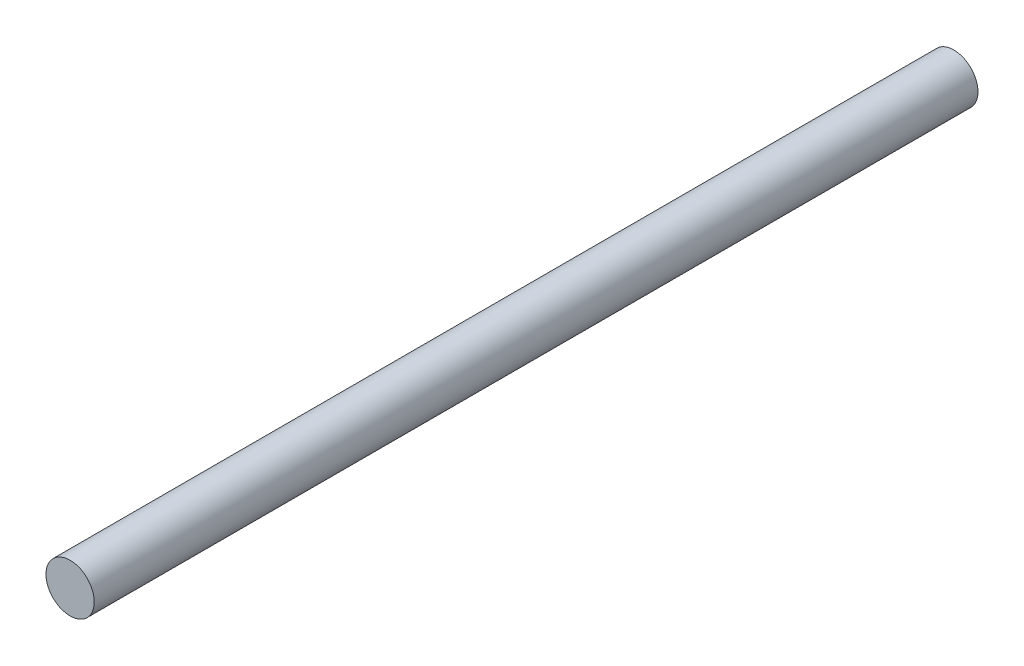
ISO-10303-21;
HEADER;
FILE_DESCRIPTION(('STEP AP214'),'2;1');
FILE_NAME('part.step','',(''),(''),'','','');
FILE_SCHEMA(('AUTOMOTIVE_DESIGN { 1 0 10303 214 1 1 1 1 }'));
ENDSEC;
DATA;
#1=APPLICATION_CONTEXT('core data for automotive mechanical design processes');
#2=APPLICATION_PROTOCOL_DEFINITION('international standard','automotive_design',2000,#1);
#3=PRODUCT_CONTEXT('',#1,'mechanical');
#4=PRODUCT('Part','Part','',(#3));
#5=PRODUCT_RELATED_PRODUCT_CATEGORY('part','',(#4));
#6=PRODUCT_DEFINITION_FORMATION('','',#4);
#7=PRODUCT_DEFINITION_CONTEXT('part definition',#1,'design');
#8=PRODUCT_DEFINITION('design','',#6,#7);
#9=PRODUCT_DEFINITION_SHAPE('','',#8);
#10=(LENGTH_UNIT() NAMED_UNIT(*) SI_UNIT(.MILLI.,.METRE.));
#11=(NAMED_UNIT(*) PLANE_ANGLE_UNIT() SI_UNIT($,.RADIAN.));
#12=(NAMED_UNIT(*) SI_UNIT($,.STERADIAN.) SOLID_ANGLE_UNIT());
#13=UNCERTAINTY_MEASURE_WITH_UNIT(LENGTH_MEASURE(1.E-05),#10,'distance_accuracy_value','');
#14=(GEOMETRIC_REPRESENTATION_CONTEXT(3) GLOBAL_UNCERTAINTY_ASSIGNED_CONTEXT((#13)) GLOBAL_UNIT_ASSIGNED_CONTEXT((#10,
#11,#12)) REPRESENTATION_CONTEXT('',''));
#15=CARTESIAN_POINT('',(0.,0.,0.));
#16=DIRECTION('',(0.,0.,1.));
#17=DIRECTION('',(1.,0.,0.));
#18=AXIS2_PLACEMENT_3D('',#15,#16,#17);
#19=CARTESIAN_POINT('',(0.,0.,108.));
#20=DIRECTION('',(0.,0.,-1.));
#21=DIRECTION('',(-1.,0.,0.));
#22=AXIS2_PLACEMENT_3D('',#19,#20,#21);
#23=CYLINDRICAL_SURFACE('',#22,2.95);
#24=CARTESIAN_POINT('',(0.,0.,108.));
#25=DIRECTION('',(0.,0.,1.));
#26=DIRECTION('',(1.,0.,0.));
#27=AXIS2_PLACEMENT_3D('',#24,#25,#26);
#28=CIRCLE('',#27,2.95);
#29=CARTESIAN_POINT('',(2.95,0.,108.));
#30=VERTEX_POINT('',#29);
#31=EDGE_CURVE('E10',#30,#30,#28,.T.);
#32=ORIENTED_EDGE('',*,*,#31,.F.);
#33=EDGE_LOOP('',(#32));
#34=FACE_BOUND('',#33,.T.);
#35=CARTESIAN_POINT('',(0.,0.,0.));
#36=DIRECTION('',(0.,0.,1.));
#37=DIRECTION('',(1.,0.,0.));
#38=AXIS2_PLACEMENT_3D('',#35,#36,#37);
#39=CIRCLE('',#38,2.95);
#40=CARTESIAN_POINT('',(2.95,0.,0.));
#41=VERTEX_POINT('',#40);
#42=EDGE_CURVE('E34',#41,#41,#39,.T.);
#43=ORIENTED_EDGE('',*,*,#42,.T.);
#44=EDGE_LOOP('',(#43));
#45=FACE_BOUND('',#44,.T.);
#46=ADVANCED_FACE('F31',(#34,#45),#23,.T.);
#47=CARTESIAN_POINT('',(0.,0.,108.));
#48=DIRECTION('',(0.,0.,1.));
#49=DIRECTION('',(1.,0.,0.));
#50=AXIS2_PLACEMENT_3D('',#47,#48,#49);
#51=PLANE('',#50);
#52=ORIENTED_EDGE('',*,*,#31,.T.);
#53=EDGE_LOOP('',(#52));
#54=FACE_BOUND('',#53,.T.);
#55=ADVANCED_FACE('F46',(#54),#51,.T.);
#56=CARTESIAN_POINT('',(0.,0.,0.));
#57=DIRECTION('',(0.,0.,1.));
#58=DIRECTION('',(1.,0.,0.));
#59=AXIS2_PLACEMENT_3D('',#56,#57,#58);
#60=PLANE('',#59);
#61=ORIENTED_EDGE('',*,*,#42,.F.);
#62=EDGE_LOOP('',(#61));
#63=FACE_BOUND('',#62,.T.);
#64=ADVANCED_FACE('F44',(#63),#60,.F.);
#65=CLOSED_SHELL('',(#46,#55,#64));
#66=MANIFOLD_SOLID_BREP('B2',#65);
#67=ADVANCED_BREP_SHAPE_REPRESENTATION('',(#18,#66),#14);
#68=SHAPE_DEFINITION_REPRESENTATION(#9,#67);
ENDSEC;
END-ISO-10303-21;
